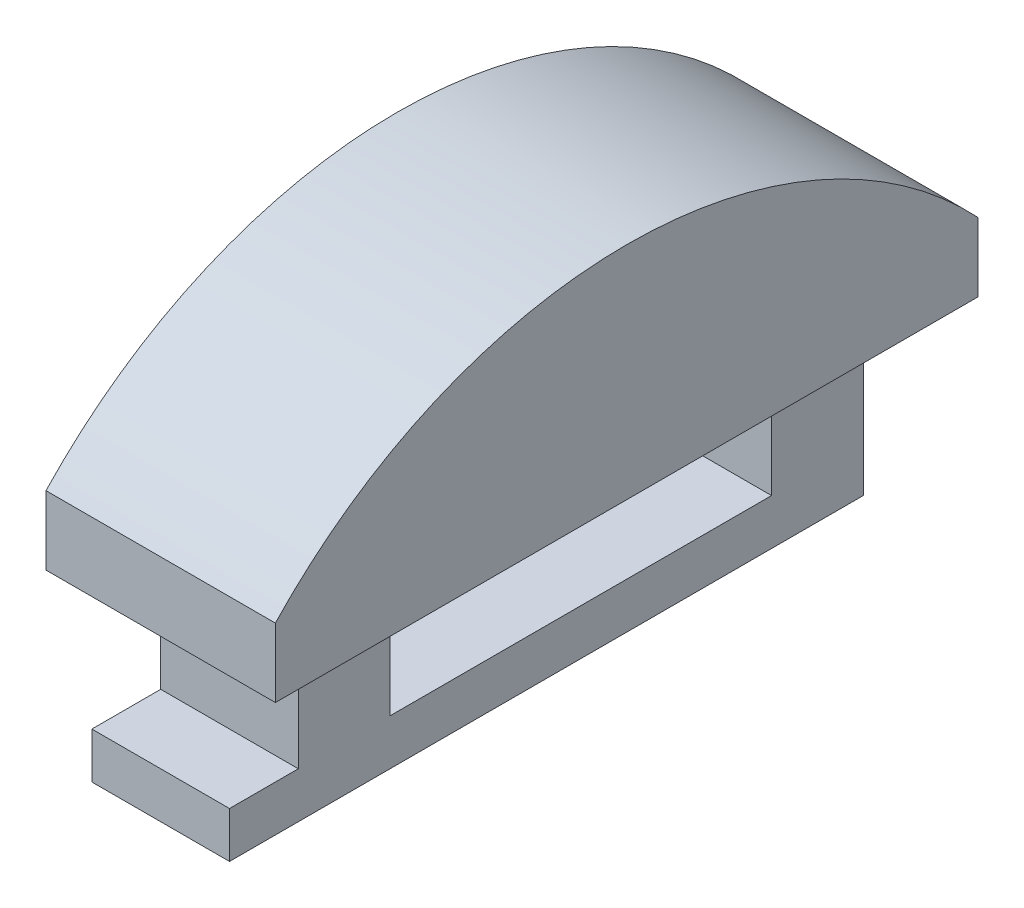
ISO-10303-21;
HEADER;
FILE_DESCRIPTION(('STEP AP214'),'2;1');
FILE_NAME('part.step','',(''),(''),'','','');
FILE_SCHEMA(('AUTOMOTIVE_DESIGN { 1 0 10303 214 1 1 1 1 }'));
ENDSEC;
DATA;
#1=APPLICATION_CONTEXT('core data for automotive mechanical design processes');
#2=APPLICATION_PROTOCOL_DEFINITION('international standard','automotive_design',2000,#1);
#3=PRODUCT_CONTEXT('',#1,'mechanical');
#4=PRODUCT('Part','Part','',(#3));
#5=PRODUCT_RELATED_PRODUCT_CATEGORY('part','',(#4));
#6=PRODUCT_DEFINITION_FORMATION('','',#4);
#7=PRODUCT_DEFINITION_CONTEXT('part definition',#1,'design');
#8=PRODUCT_DEFINITION('design','',#6,#7);
#9=PRODUCT_DEFINITION_SHAPE('','',#8);
#10=(LENGTH_UNIT() NAMED_UNIT(*) SI_UNIT(.MILLI.,.METRE.));
#11=(NAMED_UNIT(*) PLANE_ANGLE_UNIT() SI_UNIT($,.RADIAN.));
#12=(NAMED_UNIT(*) SI_UNIT($,.STERADIAN.) SOLID_ANGLE_UNIT());
#13=UNCERTAINTY_MEASURE_WITH_UNIT(LENGTH_MEASURE(1.E-05),#10,'distance_accuracy_value','');
#14=(GEOMETRIC_REPRESENTATION_CONTEXT(3) GLOBAL_UNCERTAINTY_ASSIGNED_CONTEXT((#13)) GLOBAL_UNIT_ASSIGNED_CONTEXT((#10,
#11,#12)) REPRESENTATION_CONTEXT('',''));
#15=CARTESIAN_POINT('',(0.,0.,0.));
#16=DIRECTION('',(0.,0.,1.));
#17=DIRECTION('',(1.,0.,0.));
#18=AXIS2_PLACEMENT_3D('',#15,#16,#17);
#19=CARTESIAN_POINT('',(0.,0.,0.));
#20=DIRECTION('',(0.,1.,0.));
#21=DIRECTION('',(0.,0.,1.));
#22=AXIS2_PLACEMENT_3D('',#19,#20,#21);
#23=PLANE('',#22);
#24=DIRECTION('',(0.,0.,-1.));
#25=VECTOR('',#24,1.);
#26=CARTESIAN_POINT('',(-90.5718135811089,0.,-6.71263640696108));
#27=LINE('',#26,#25);
#28=CARTESIAN_POINT('',(-90.5718135811089,0.,-6.71263640696108));
#29=VERTEX_POINT('',#28);
#30=CARTESIAN_POINT('',(-90.5718135811089,0.,-10.7126364069611));
#31=VERTEX_POINT('',#30);
#32=EDGE_CURVE('E196',#29,#31,#27,.T.);
#33=ORIENTED_EDGE('',*,*,#32,.F.);
#34=DIRECTION('',(-1.,0.,0.));
#35=VECTOR('',#34,1.);
#36=CARTESIAN_POINT('',(-90.5718135811089,0.,-6.71263640696108));
#37=LINE('',#36,#35);
#38=CARTESIAN_POINT('',(-84.5718135811089,0.,-6.71263640696108));
#39=VERTEX_POINT('',#38);
#40=EDGE_CURVE('E201',#39,#29,#37,.T.);
#41=ORIENTED_EDGE('',*,*,#40,.F.);
#42=DIRECTION('',(0.,0.,1.));
#43=VECTOR('',#42,1.);
#44=CARTESIAN_POINT('',(-84.5718135811089,0.,-6.71263640696108));
#45=LINE('',#44,#43);
#46=CARTESIAN_POINT('',(-84.5718135811089,0.,-10.7126364069611));
#47=VERTEX_POINT('',#46);
#48=EDGE_CURVE('E207',#47,#39,#45,.T.);
#49=ORIENTED_EDGE('',*,*,#48,.F.);
#50=DIRECTION('',(1.,0.,0.));
#51=VECTOR('',#50,1.);
#52=CARTESIAN_POINT('',(-90.5718135811089,0.,-10.7126364069611));
#53=LINE('',#52,#51);
#54=EDGE_CURVE('E204',#31,#47,#53,.T.);
#55=ORIENTED_EDGE('',*,*,#54,.F.);
#56=EDGE_LOOP('',(#33,#41,#49,#55));
#57=FACE_BOUND('',#56,.T.);
#58=DIRECTION('',(0.,0.,1.));
#59=VECTOR('',#58,1.);
#60=CARTESIAN_POINT('',(-92.5718135811089,0.,-13.7126364069611));
#61=LINE('',#60,#59);
#62=CARTESIAN_POINT('',(-92.5718135811089,0.,-13.7126364069611));
#63=VERTEX_POINT('',#62);
#64=CARTESIAN_POINT('',(-92.5718135811089,0.,16.9173635930389));
#65=VERTEX_POINT('',#64);
#66=EDGE_CURVE('E225',#63,#65,#61,.T.);
#67=ORIENTED_EDGE('',*,*,#66,.F.);
#68=DIRECTION('',(-1.,0.,0.));
#69=VECTOR('',#68,1.);
#70=CARTESIAN_POINT('',(-92.5718135811089,0.,-13.7126364069611));
#71=LINE('',#70,#69);
#72=CARTESIAN_POINT('',(-82.5718135811089,0.,-13.7126364069611));
#73=VERTEX_POINT('',#72);
#74=EDGE_CURVE('E232',#73,#63,#71,.T.);
#75=ORIENTED_EDGE('',*,*,#74,.F.);
#76=DIRECTION('',(0.,0.,-1.));
#77=VECTOR('',#76,1.);
#78=CARTESIAN_POINT('',(-82.5718135811089,0.,-13.7126364069611));
#79=LINE('',#78,#77);
#80=CARTESIAN_POINT('',(-82.5718135811089,0.,16.9173635930389));
#81=VERTEX_POINT('',#80);
#82=EDGE_CURVE('E240',#81,#73,#79,.T.);
#83=ORIENTED_EDGE('',*,*,#82,.F.);
#84=DIRECTION('',(1.,0.,0.));
#85=VECTOR('',#84,1.);
#86=CARTESIAN_POINT('',(-92.5718135811089,0.,16.9173635930389));
#87=LINE('',#86,#85);
#88=EDGE_CURVE('E238',#65,#81,#87,.T.);
#89=ORIENTED_EDGE('',*,*,#88,.F.);
#90=EDGE_LOOP('',(#67,#75,#83,#89));
#91=FACE_BOUND('',#90,.T.);
#92=DIRECTION('',(1.,0.,0.));
#93=VECTOR('',#92,1.);
#94=CARTESIAN_POINT('',(-84.5718135811089,0.,9.91736359303892));
#95=LINE('',#94,#93);
#96=CARTESIAN_POINT('',(-90.5629687920303,0.,9.91736359303892));
#97=VERTEX_POINT('',#96);
#98=CARTESIAN_POINT('',(-84.5718135811089,0.,9.91736359303892));
#99=VERTEX_POINT('',#98);
#100=EDGE_CURVE('E164',#97,#99,#95,.T.);
#101=ORIENTED_EDGE('',*,*,#100,.F.);
#102=DIRECTION('',(0.00221119186397757,0.,-0.999997555312282));
#103=VECTOR('',#102,1.);
#104=CARTESIAN_POINT('',(-90.5629687920303,0.,9.91736359303892));
#105=LINE('',#104,#103);
#106=CARTESIAN_POINT('',(-90.5718135811089,0.,13.9173635930389));
#107=VERTEX_POINT('',#106);
#108=EDGE_CURVE('E175',#107,#97,#105,.T.);
#109=ORIENTED_EDGE('',*,*,#108,.F.);
#110=DIRECTION('',(-1.,0.,0.));
#111=VECTOR('',#110,1.);
#112=CARTESIAN_POINT('',(-90.5718135811089,0.,13.9173635930389));
#113=LINE('',#112,#111);
#114=CARTESIAN_POINT('',(-84.5718135811089,0.,13.9173635930389));
#115=VERTEX_POINT('',#114);
#116=EDGE_CURVE('E57',#115,#107,#113,.T.);
#117=ORIENTED_EDGE('',*,*,#116,.F.);
#118=DIRECTION('',(0.,0.,1.));
#119=VECTOR('',#118,1.);
#120=CARTESIAN_POINT('',(-84.5718135811089,0.,13.9173635930389));
#121=LINE('',#120,#119);
#122=EDGE_CURVE('E52',#99,#115,#121,.T.);
#123=ORIENTED_EDGE('',*,*,#122,.F.);
#124=EDGE_LOOP('',(#101,#109,#117,#123));
#125=FACE_BOUND('',#124,.T.);
#126=ADVANCED_FACE('F37',(#57,#91,#125),#23,.F.);
#127=CARTESIAN_POINT('',(-92.5718135811089,3.,-13.7126364069611));
#128=DIRECTION('',(1.,0.,0.));
#129=DIRECTION('',(0.,0.,-1.));
#130=AXIS2_PLACEMENT_3D('',#127,#128,#129);
#131=PLANE('',#130);
#132=ORIENTED_EDGE('',*,*,#66,.T.);
#133=DIRECTION('',(0.,-1.,0.));
#134=VECTOR('',#133,1.);
#135=CARTESIAN_POINT('',(-92.5718135811089,3.,16.9173635930389));
#136=LINE('',#135,#134);
#137=CARTESIAN_POINT('',(-92.5718135811089,3.,16.9173635930389));
#138=VERTEX_POINT('',#137);
#139=EDGE_CURVE('E11',#138,#65,#136,.T.);
#140=ORIENTED_EDGE('',*,*,#139,.F.);
#141=CARTESIAN_POINT('',(-92.5718135811089,-11.3683950043142,1.60236359303887));
#142=DIRECTION('',(1.,0.,0.));
#143=DIRECTION('',(0.,0.,1.));
#144=AXIS2_PLACEMENT_3D('',#141,#142,#143);
#145=CIRCLE('',#144,21.);
#146=CARTESIAN_POINT('',(-92.5718135811089,3.,-13.7126364069611));
#147=VERTEX_POINT('',#146);
#148=EDGE_CURVE('E222',#147,#138,#145,.T.);
#149=ORIENTED_EDGE('',*,*,#148,.F.);
#150=DIRECTION('',(0.,-1.,0.));
#151=VECTOR('',#150,1.);
#152=CARTESIAN_POINT('',(-92.5718135811089,3.,-13.7126364069611));
#153=LINE('',#152,#151);
#154=EDGE_CURVE('E235',#147,#63,#153,.T.);
#155=ORIENTED_EDGE('',*,*,#154,.T.);
#156=EDGE_LOOP('',(#132,#140,#149,#155));
#157=FACE_BOUND('',#156,.T.);
#158=ADVANCED_FACE('F39',(#157),#131,.F.);
#159=CARTESIAN_POINT('',(-92.5718135811089,3.,16.9173635930389));
#160=DIRECTION('',(0.,0.,-1.));
#161=DIRECTION('',(-1.,0.,0.));
#162=AXIS2_PLACEMENT_3D('',#159,#160,#161);
#163=PLANE('',#162);
#164=ORIENTED_EDGE('',*,*,#88,.T.);
#165=DIRECTION('',(0.,-1.,0.));
#166=VECTOR('',#165,1.);
#167=CARTESIAN_POINT('',(-82.5718135811089,3.,16.9173635930389));
#168=LINE('',#167,#166);
#169=CARTESIAN_POINT('',(-82.5718135811089,3.,16.9173635930389));
#170=VERTEX_POINT('',#169);
#171=EDGE_CURVE('E45',#170,#81,#168,.T.);
#172=ORIENTED_EDGE('',*,*,#171,.F.);
#173=DIRECTION('',(1.,0.,0.));
#174=VECTOR('',#173,1.);
#175=CARTESIAN_POINT('',(-92.5718135811089,3.,16.9173635930389));
#176=LINE('',#175,#174);
#177=EDGE_CURVE('E228',#138,#170,#176,.T.);
#178=ORIENTED_EDGE('',*,*,#177,.F.);
#179=ORIENTED_EDGE('',*,*,#139,.T.);
#180=EDGE_LOOP('',(#164,#172,#178,#179));
#181=FACE_BOUND('',#180,.T.);
#182=ADVANCED_FACE('F264',(#181),#163,.F.);
#183=CARTESIAN_POINT('',(-82.5718135811089,3.,-13.7126364069611));
#184=DIRECTION('',(-1.,0.,0.));
#185=DIRECTION('',(0.,0.,1.));
#186=AXIS2_PLACEMENT_3D('',#183,#184,#185);
#187=PLANE('',#186);
#188=ORIENTED_EDGE('',*,*,#82,.T.);
#189=DIRECTION('',(0.,-1.,0.));
#190=VECTOR('',#189,1.);
#191=CARTESIAN_POINT('',(-82.5718135811089,3.,-13.7126364069611));
#192=LINE('',#191,#190);
#193=CARTESIAN_POINT('',(-82.5718135811089,3.,-13.7126364069611));
#194=VERTEX_POINT('',#193);
#195=EDGE_CURVE('E245',#194,#73,#192,.T.);
#196=ORIENTED_EDGE('',*,*,#195,.F.);
#197=CARTESIAN_POINT('',(-82.5718135811089,-11.3683950043142,1.60236359303887));
#198=DIRECTION('',(1.,0.,0.));
#199=DIRECTION('',(0.,0.,1.));
#200=AXIS2_PLACEMENT_3D('',#197,#198,#199);
#201=CIRCLE('',#200,21.);
#202=EDGE_CURVE('E221',#194,#170,#201,.T.);
#203=ORIENTED_EDGE('',*,*,#202,.T.);
#204=ORIENTED_EDGE('',*,*,#171,.T.);
#205=EDGE_LOOP('',(#188,#196,#203,#204));
#206=FACE_BOUND('',#205,.T.);
#207=ADVANCED_FACE('F250',(#206),#187,.F.);
#208=CARTESIAN_POINT('',(-92.5718135811089,3.,-13.7126364069611));
#209=DIRECTION('',(0.,0.,1.));
#210=DIRECTION('',(1.,0.,0.));
#211=AXIS2_PLACEMENT_3D('',#208,#209,#210);
#212=PLANE('',#211);
#213=ORIENTED_EDGE('',*,*,#74,.T.);
#214=ORIENTED_EDGE('',*,*,#154,.F.);
#215=DIRECTION('',(-1.,0.,0.));
#216=VECTOR('',#215,1.);
#217=CARTESIAN_POINT('',(-92.5718135811089,3.,-13.7126364069611));
#218=LINE('',#217,#216);
#219=EDGE_CURVE('E231',#194,#147,#218,.T.);
#220=ORIENTED_EDGE('',*,*,#219,.F.);
#221=ORIENTED_EDGE('',*,*,#195,.T.);
#222=EDGE_LOOP('',(#213,#214,#220,#221));
#223=FACE_BOUND('',#222,.T.);
#224=ADVANCED_FACE('F258',(#223),#212,.F.);
#225=CARTESIAN_POINT('',(-92.5718135811089,-11.3683950043142,1.60236359303887));
#226=DIRECTION('',(1.,0.,0.));
#227=DIRECTION('',(0.,0.,-1.));
#228=AXIS2_PLACEMENT_3D('',#225,#226,#227);
#229=CYLINDRICAL_SURFACE('',#228,21.);
#230=ORIENTED_EDGE('',*,*,#202,.F.);
#231=ORIENTED_EDGE('',*,*,#219,.T.);
#232=ORIENTED_EDGE('',*,*,#148,.T.);
#233=ORIENTED_EDGE('',*,*,#177,.T.);
#234=EDGE_LOOP('',(#230,#231,#232,#233));
#235=FACE_BOUND('',#234,.T.);
#236=ADVANCED_FACE('F263',(#235),#229,.T.);
#237=CARTESIAN_POINT('',(-90.5718135811089,-5.,-6.71263640696108));
#238=DIRECTION('',(1.,0.,0.));
#239=DIRECTION('',(0.,0.,-1.));
#240=AXIS2_PLACEMENT_3D('',#237,#238,#239);
#241=PLANE('',#240);
#242=ORIENTED_EDGE('',*,*,#32,.T.);
#243=DIRECTION('',(0.,1.,0.));
#244=VECTOR('',#243,1.);
#245=CARTESIAN_POINT('',(-90.5718135811089,-5.,-10.7126364069611));
#246=LINE('',#245,#244);
#247=CARTESIAN_POINT('',(-90.5718135811089,-7.,-10.7126364069611));
#248=VERTEX_POINT('',#247);
#249=EDGE_CURVE('E218',#248,#31,#246,.T.);
#250=ORIENTED_EDGE('',*,*,#249,.F.);
#251=DIRECTION('',(0.,0.,-1.));
#252=VECTOR('',#251,1.);
#253=CARTESIAN_POINT('',(-90.5718135811089,-7.,-10.7126364069611));
#254=LINE('',#253,#252);
#255=CARTESIAN_POINT('',(-90.5718135811089,-7.,16.9173635930389));
#256=VERTEX_POINT('',#255);
#257=EDGE_CURVE('E146',#256,#248,#254,.T.);
#258=ORIENTED_EDGE('',*,*,#257,.F.);
#259=DIRECTION('',(0.,1.,0.));
#260=VECTOR('',#259,1.);
#261=CARTESIAN_POINT('',(-90.5718135811089,-7.,16.9173635930389));
#262=LINE('',#261,#260);
#263=CARTESIAN_POINT('',(-90.5718135811089,-5.,16.9173635930389));
#264=VERTEX_POINT('',#263);
#265=EDGE_CURVE('E142',#256,#264,#262,.T.);
#266=ORIENTED_EDGE('',*,*,#265,.T.);
#267=DIRECTION('',(0.,0.,-1.));
#268=VECTOR('',#267,1.);
#269=CARTESIAN_POINT('',(-90.5718135811089,-5.,-10.7126364069611));
#270=LINE('',#269,#268);
#271=CARTESIAN_POINT('',(-90.5718135811089,-5.,13.9173635930389));
#272=VERTEX_POINT('',#271);
#273=EDGE_CURVE('E157',#264,#272,#270,.T.);
#274=ORIENTED_EDGE('',*,*,#273,.T.);
#275=CARTESIAN_POINT('',(-90.5718135811089,-5.,-6.71263640696108));
#276=VERTEX_POINT('',#275);
#277=EDGE_CURVE('E361',#272,#276,#270,.T.);
#278=ORIENTED_EDGE('',*,*,#277,.T.);
#279=DIRECTION('',(0.,1.,0.));
#280=VECTOR('',#279,1.);
#281=CARTESIAN_POINT('',(-90.5718135811089,-5.,-6.71263640696108));
#282=LINE('',#281,#280);
#283=EDGE_CURVE('E200',#276,#29,#282,.T.);
#284=ORIENTED_EDGE('',*,*,#283,.T.);
#285=EDGE_LOOP('',(#242,#250,#258,#266,#274,#278,#284));
#286=FACE_BOUND('',#285,.T.);
#287=ADVANCED_FACE('F283',(#286),#241,.F.);
#288=CARTESIAN_POINT('',(-90.5718135811089,-5.,-10.7126364069611));
#289=DIRECTION('',(0.,0.,1.));
#290=DIRECTION('',(1.,0.,0.));
#291=AXIS2_PLACEMENT_3D('',#288,#289,#290);
#292=PLANE('',#291);
#293=ORIENTED_EDGE('',*,*,#54,.T.);
#294=DIRECTION('',(0.,1.,0.));
#295=VECTOR('',#294,1.);
#296=CARTESIAN_POINT('',(-84.5718135811089,-5.,-10.7126364069611));
#297=LINE('',#296,#295);
#298=CARTESIAN_POINT('',(-84.5718135811089,-7.,-10.7126364069611));
#299=VERTEX_POINT('',#298);
#300=EDGE_CURVE('E216',#299,#47,#297,.T.);
#301=ORIENTED_EDGE('',*,*,#300,.F.);
#302=DIRECTION('',(1.,0.,0.));
#303=VECTOR('',#302,1.);
#304=CARTESIAN_POINT('',(-84.5718135811089,-7.,-10.7126364069611));
#305=LINE('',#304,#303);
#306=EDGE_CURVE('E154',#248,#299,#305,.T.);
#307=ORIENTED_EDGE('',*,*,#306,.F.);
#308=ORIENTED_EDGE('',*,*,#249,.T.);
#309=EDGE_LOOP('',(#293,#301,#307,#308));
#310=FACE_BOUND('',#309,.T.);
#311=ADVANCED_FACE('F287',(#310),#292,.F.);
#312=CARTESIAN_POINT('',(-84.5718135811089,-5.,-6.71263640696108));
#313=DIRECTION('',(-1.,0.,0.));
#314=DIRECTION('',(0.,0.,1.));
#315=AXIS2_PLACEMENT_3D('',#312,#313,#314);
#316=PLANE('',#315);
#317=ORIENTED_EDGE('',*,*,#48,.T.);
#318=DIRECTION('',(0.,1.,0.));
#319=VECTOR('',#318,1.);
#320=CARTESIAN_POINT('',(-84.5718135811089,-5.,-6.71263640696108));
#321=LINE('',#320,#319);
#322=CARTESIAN_POINT('',(-84.5718135811089,-5.,-6.71263640696108));
#323=VERTEX_POINT('',#322);
#324=EDGE_CURVE('E213',#323,#39,#321,.T.);
#325=ORIENTED_EDGE('',*,*,#324,.F.);
#326=DIRECTION('',(0.,0.,1.));
#327=VECTOR('',#326,1.);
#328=CARTESIAN_POINT('',(-84.5718135811089,-5.,-10.7126364069611));
#329=LINE('',#328,#327);
#330=CARTESIAN_POINT('',(-84.5718135811089,-5.,9.91736359303892));
#331=VERTEX_POINT('',#330);
#332=EDGE_CURVE('E359',#323,#331,#329,.T.);
#333=ORIENTED_EDGE('',*,*,#332,.T.);
#334=DIRECTION('',(0.,1.,0.));
#335=VECTOR('',#334,1.);
#336=CARTESIAN_POINT('',(-84.5718135811089,-5.,9.91736359303892));
#337=LINE('',#336,#335);
#338=EDGE_CURVE('E194',#331,#99,#337,.T.);
#339=ORIENTED_EDGE('',*,*,#338,.T.);
#340=ORIENTED_EDGE('',*,*,#122,.T.);
#341=DIRECTION('',(0.,1.,0.));
#342=VECTOR('',#341,1.);
#343=CARTESIAN_POINT('',(-84.5718135811089,-5.,13.9173635930389));
#344=LINE('',#343,#342);
#345=CARTESIAN_POINT('',(-84.5718135811089,-5.,13.9173635930389));
#346=VERTEX_POINT('',#345);
#347=EDGE_CURVE('E191',#346,#115,#344,.T.);
#348=ORIENTED_EDGE('',*,*,#347,.F.);
#349=CARTESIAN_POINT('',(-84.5718135811089,-5.,16.9173635930389));
#350=VERTEX_POINT('',#349);
#351=EDGE_CURVE('E162',#346,#350,#329,.T.);
#352=ORIENTED_EDGE('',*,*,#351,.T.);
#353=DIRECTION('',(0.,1.,0.));
#354=VECTOR('',#353,1.);
#355=CARTESIAN_POINT('',(-84.5718135811089,-7.,16.9173635930389));
#356=LINE('',#355,#354);
#357=CARTESIAN_POINT('',(-84.5718135811089,-7.,16.9173635930389));
#358=VERTEX_POINT('',#357);
#359=EDGE_CURVE('E140',#358,#350,#356,.T.);
#360=ORIENTED_EDGE('',*,*,#359,.F.);
#361=DIRECTION('',(0.,0.,1.));
#362=VECTOR('',#361,1.);
#363=CARTESIAN_POINT('',(-84.5718135811089,-7.,-10.7126364069611));
#364=LINE('',#363,#362);
#365=EDGE_CURVE('E147',#299,#358,#364,.T.);
#366=ORIENTED_EDGE('',*,*,#365,.F.);
#367=ORIENTED_EDGE('',*,*,#300,.T.);
#368=EDGE_LOOP('',(#317,#325,#333,#339,#340,#348,#352,#360,#366,#367));
#369=FACE_BOUND('',#368,.T.);
#370=ADVANCED_FACE('F160',(#369),#316,.F.);
#371=CARTESIAN_POINT('',(-90.5718135811089,-5.,-6.71263640696108));
#372=DIRECTION('',(0.,0.,-1.));
#373=DIRECTION('',(-1.,0.,0.));
#374=AXIS2_PLACEMENT_3D('',#371,#372,#373);
#375=PLANE('',#374);
#376=ORIENTED_EDGE('',*,*,#40,.T.);
#377=ORIENTED_EDGE('',*,*,#283,.F.);
#378=DIRECTION('',(-1.,0.,0.));
#379=VECTOR('',#378,1.);
#380=CARTESIAN_POINT('',(-90.5718135811089,-5.,-6.71263640696108));
#381=LINE('',#380,#379);
#382=EDGE_CURVE('E197',#323,#276,#381,.T.);
#383=ORIENTED_EDGE('',*,*,#382,.F.);
#384=ORIENTED_EDGE('',*,*,#324,.T.);
#385=EDGE_LOOP('',(#376,#377,#383,#384));
#386=FACE_BOUND('',#385,.T.);
#387=ADVANCED_FACE('F297',(#386),#375,.F.);
#388=CARTESIAN_POINT('',(-84.5718135811089,-5.,9.91736359303892));
#389=DIRECTION('',(0.,0.,1.));
#390=DIRECTION('',(1.,0.,0.));
#391=AXIS2_PLACEMENT_3D('',#388,#389,#390);
#392=PLANE('',#391);
#393=ORIENTED_EDGE('',*,*,#100,.T.);
#394=ORIENTED_EDGE('',*,*,#338,.F.);
#395=DIRECTION('',(1.,0.,0.));
#396=VECTOR('',#395,1.);
#397=CARTESIAN_POINT('',(-84.5718135811089,-5.,9.91736359303892));
#398=LINE('',#397,#396);
#399=CARTESIAN_POINT('',(-90.5629687920303,-5.,9.91736359303892));
#400=VERTEX_POINT('',#399);
#401=EDGE_CURVE('E171',#400,#331,#398,.T.);
#402=ORIENTED_EDGE('',*,*,#401,.F.);
#403=DIRECTION('',(0.,1.,0.));
#404=VECTOR('',#403,1.);
#405=CARTESIAN_POINT('',(-90.5629687920303,-5.,9.91736359303892));
#406=LINE('',#405,#404);
#407=EDGE_CURVE('E180',#400,#97,#406,.T.);
#408=ORIENTED_EDGE('',*,*,#407,.T.);
#409=EDGE_LOOP('',(#393,#394,#402,#408));
#410=FACE_BOUND('',#409,.T.);
#411=ADVANCED_FACE('F300',(#410),#392,.F.);
#412=CARTESIAN_POINT('',(-90.5718135811089,-5.,13.9173635930389));
#413=DIRECTION('',(0.,0.,-1.));
#414=DIRECTION('',(-1.,0.,0.));
#415=AXIS2_PLACEMENT_3D('',#412,#413,#414);
#416=PLANE('',#415);
#417=ORIENTED_EDGE('',*,*,#116,.T.);
#418=DIRECTION('',(0.,1.,0.));
#419=VECTOR('',#418,1.);
#420=CARTESIAN_POINT('',(-90.5718135811089,-5.,13.9173635930389));
#421=LINE('',#420,#419);
#422=EDGE_CURVE('E188',#272,#107,#421,.T.);
#423=ORIENTED_EDGE('',*,*,#422,.F.);
#424=DIRECTION('',(-1.,0.,0.));
#425=VECTOR('',#424,1.);
#426=CARTESIAN_POINT('',(-90.5718135811089,-5.,13.9173635930389));
#427=LINE('',#426,#425);
#428=EDGE_CURVE('E174',#346,#272,#427,.T.);
#429=ORIENTED_EDGE('',*,*,#428,.F.);
#430=ORIENTED_EDGE('',*,*,#347,.T.);
#431=EDGE_LOOP('',(#417,#423,#429,#430));
#432=FACE_BOUND('',#431,.T.);
#433=ADVANCED_FACE('F310',(#432),#416,.F.);
#434=CARTESIAN_POINT('',(-90.5629687920303,-5.,9.91736359303892));
#435=DIRECTION('',(0.999997555312282,0.,0.00221119186397757));
#436=DIRECTION('',(0.00221119186397757,0.,-0.999997555312282));
#437=AXIS2_PLACEMENT_3D('',#434,#435,#436);
#438=PLANE('',#437);
#439=ORIENTED_EDGE('',*,*,#108,.T.);
#440=ORIENTED_EDGE('',*,*,#407,.F.);
#441=DIRECTION('',(0.00221119186397757,0.,-0.999997555312282));
#442=VECTOR('',#441,1.);
#443=CARTESIAN_POINT('',(-90.5629687920303,-5.,9.91736359303892));
#444=LINE('',#443,#442);
#445=EDGE_CURVE('E178',#272,#400,#444,.T.);
#446=ORIENTED_EDGE('',*,*,#445,.F.);
#447=ORIENTED_EDGE('',*,*,#422,.T.);
#448=EDGE_LOOP('',(#439,#440,#446,#447));
#449=FACE_BOUND('',#448,.T.);
#450=ADVANCED_FACE('F314',(#449),#438,.F.);
#451=CARTESIAN_POINT('',(0.,-5.,0.));
#452=DIRECTION('',(0.,-1.,0.));
#453=DIRECTION('',(0.,0.,-1.));
#454=AXIS2_PLACEMENT_3D('',#451,#452,#453);
#455=PLANE('',#454);
#456=ORIENTED_EDGE('',*,*,#332,.F.);
#457=ORIENTED_EDGE('',*,*,#382,.T.);
#458=ORIENTED_EDGE('',*,*,#277,.F.);
#459=ORIENTED_EDGE('',*,*,#445,.T.);
#460=ORIENTED_EDGE('',*,*,#401,.T.);
#461=EDGE_LOOP('',(#456,#457,#458,#459,#460));
#462=FACE_BOUND('',#461,.T.);
#463=ADVANCED_FACE('F318',(#462),#455,.F.);
#464=ORIENTED_EDGE('',*,*,#351,.F.);
#465=ORIENTED_EDGE('',*,*,#428,.T.);
#466=ORIENTED_EDGE('',*,*,#273,.F.);
#467=DIRECTION('',(-1.,0.,0.));
#468=VECTOR('',#467,1.);
#469=CARTESIAN_POINT('',(-84.5718135811089,-5.,16.9173635930389));
#470=LINE('',#469,#468);
#471=EDGE_CURVE('E360',#350,#264,#470,.T.);
#472=ORIENTED_EDGE('',*,*,#471,.F.);
#473=EDGE_LOOP('',(#464,#465,#466,#472));
#474=FACE_BOUND('',#473,.T.);
#475=ADVANCED_FACE('F328',(#474),#455,.F.);
#476=CARTESIAN_POINT('',(0.,-7.,0.));
#477=DIRECTION('',(0.,-1.,0.));
#478=DIRECTION('',(0.,0.,-1.));
#479=AXIS2_PLACEMENT_3D('',#476,#477,#478);
#480=PLANE('',#479);
#481=CARTESIAN_POINT('',(-87.5718135811089,-7.,11.9173635930389));
#482=DIRECTION('',(0.,-1.,0.));
#483=DIRECTION('',(0.,0.,-1.));
#484=AXIS2_PLACEMENT_3D('',#481,#482,#483);
#485=CIRCLE('',#484,1.5);
#486=CARTESIAN_POINT('',(-87.5718135811089,-7.,10.4173635930389));
#487=VERTEX_POINT('',#486);
#488=EDGE_CURVE('E351',#487,#487,#485,.T.);
#489=ORIENTED_EDGE('',*,*,#488,.F.);
#490=EDGE_LOOP('',(#489));
#491=FACE_BOUND('',#490,.T.);
#492=ORIENTED_EDGE('',*,*,#365,.T.);
#493=DIRECTION('',(-1.,0.,0.));
#494=VECTOR('',#493,1.);
#495=CARTESIAN_POINT('',(-84.5718135811089,-7.,16.9173635930389));
#496=LINE('',#495,#494);
#497=EDGE_CURVE('E136',#358,#256,#496,.T.);
#498=ORIENTED_EDGE('',*,*,#497,.T.);
#499=ORIENTED_EDGE('',*,*,#257,.T.);
#500=ORIENTED_EDGE('',*,*,#306,.T.);
#501=EDGE_LOOP('',(#492,#498,#499,#500));
#502=FACE_BOUND('',#501,.T.);
#503=CARTESIAN_POINT('',(-87.5718135811089,-7.,-8.71263640696108));
#504=DIRECTION('',(0.,-1.,0.));
#505=DIRECTION('',(0.,0.,-1.));
#506=AXIS2_PLACEMENT_3D('',#503,#504,#505);
#507=CIRCLE('',#506,1.5);
#508=CARTESIAN_POINT('',(-87.5718135811089,-7.,-10.2126364069611));
#509=VERTEX_POINT('',#508);
#510=EDGE_CURVE('E343',#509,#509,#507,.T.);
#511=ORIENTED_EDGE('',*,*,#510,.F.);
#512=EDGE_LOOP('',(#511));
#513=FACE_BOUND('',#512,.T.);
#514=ADVANCED_FACE('F151',(#491,#502,#513),#480,.T.);
#515=CARTESIAN_POINT('',(-84.5718135811089,-7.,16.9173635930389));
#516=DIRECTION('',(0.,0.,-1.));
#517=DIRECTION('',(-1.,0.,0.));
#518=AXIS2_PLACEMENT_3D('',#515,#516,#517);
#519=PLANE('',#518);
#520=ORIENTED_EDGE('',*,*,#471,.T.);
#521=ORIENTED_EDGE('',*,*,#265,.F.);
#522=ORIENTED_EDGE('',*,*,#497,.F.);
#523=ORIENTED_EDGE('',*,*,#359,.T.);
#524=EDGE_LOOP('',(#520,#521,#522,#523));
#525=FACE_BOUND('',#524,.T.);
#526=ADVANCED_FACE('F138',(#525),#519,.F.);
#527=CARTESIAN_POINT('',(-87.5718135811089,-7.,11.9173635930389));
#528=DIRECTION('',(0.,1.,0.));
#529=DIRECTION('',(0.,0.,1.));
#530=AXIS2_PLACEMENT_3D('',#527,#528,#529);
#531=CYLINDRICAL_SURFACE('',#530,1.5);
#532=ORIENTED_EDGE('',*,*,#488,.T.);
#533=EDGE_LOOP('',(#532));
#534=FACE_BOUND('',#533,.T.);
#535=CARTESIAN_POINT('',(-87.5718135811089,-5.,11.9173635930389));
#536=DIRECTION('',(0.,-1.,0.));
#537=DIRECTION('',(0.,0.,-1.));
#538=AXIS2_PLACEMENT_3D('',#535,#536,#537);
#539=CIRCLE('',#538,1.5);
#540=CARTESIAN_POINT('',(-87.5718135811089,-5.,10.4173635930389));
#541=VERTEX_POINT('',#540);
#542=EDGE_CURVE('E348',#541,#541,#539,.T.);
#543=ORIENTED_EDGE('',*,*,#542,.F.);
#544=EDGE_LOOP('',(#543));
#545=FACE_BOUND('',#544,.T.);
#546=ADVANCED_FACE('F325',(#534,#545),#531,.F.);
#547=CARTESIAN_POINT('',(-87.5718135811089,-7.,-8.71263640696108));
#548=DIRECTION('',(0.,1.,0.));
#549=DIRECTION('',(0.,0.,1.));
#550=AXIS2_PLACEMENT_3D('',#547,#548,#549);
#551=CYLINDRICAL_SURFACE('',#550,1.5);
#552=ORIENTED_EDGE('',*,*,#510,.T.);
#553=EDGE_LOOP('',(#552));
#554=FACE_BOUND('',#553,.T.);
#555=CARTESIAN_POINT('',(-87.5718135811089,-5.,-8.71263640696108));
#556=DIRECTION('',(0.,-1.,0.));
#557=DIRECTION('',(0.,0.,-1.));
#558=AXIS2_PLACEMENT_3D('',#555,#556,#557);
#559=CIRCLE('',#558,1.5);
#560=CARTESIAN_POINT('',(-87.5718135811089,-5.,-10.2126364069611));
#561=VERTEX_POINT('',#560);
#562=EDGE_CURVE('E346',#561,#561,#559,.T.);
#563=ORIENTED_EDGE('',*,*,#562,.F.);
#564=EDGE_LOOP('',(#563));
#565=FACE_BOUND('',#564,.T.);
#566=ADVANCED_FACE('F306',(#554,#565),#551,.F.);
#567=CARTESIAN_POINT('',(0.,-5.,0.));
#568=DIRECTION('',(0.,-1.,0.));
#569=DIRECTION('',(0.,0.,-1.));
#570=AXIS2_PLACEMENT_3D('',#567,#568,#569);
#571=PLANE('',#570);
#572=ORIENTED_EDGE('',*,*,#562,.T.);
#573=EDGE_LOOP('',(#572));
#574=FACE_BOUND('',#573,.T.);
#575=ADVANCED_FACE('F302',(#574),#571,.T.);
#576=CARTESIAN_POINT('',(0.,-5.,0.));
#577=DIRECTION('',(0.,-1.,0.));
#578=DIRECTION('',(0.,0.,-1.));
#579=AXIS2_PLACEMENT_3D('',#576,#577,#578);
#580=PLANE('',#579);
#581=ORIENTED_EDGE('',*,*,#542,.T.);
#582=EDGE_LOOP('',(#581));
#583=FACE_BOUND('',#582,.T.);
#584=ADVANCED_FACE('F305',(#583),#580,.T.);
#585=CLOSED_SHELL('',(#126,#158,#182,#207,#224,#236,#287,#311,#370,#387,#411,#433,#450,#463,
#475,#514,#526,#546,#566,#575,#584));
#586=MANIFOLD_SOLID_BREP('B2',#585);
#587=ADVANCED_BREP_SHAPE_REPRESENTATION('',(#18,#586),#14);
#588=SHAPE_DEFINITION_REPRESENTATION(#9,#587);
ENDSEC;
END-ISO-10303-21;
